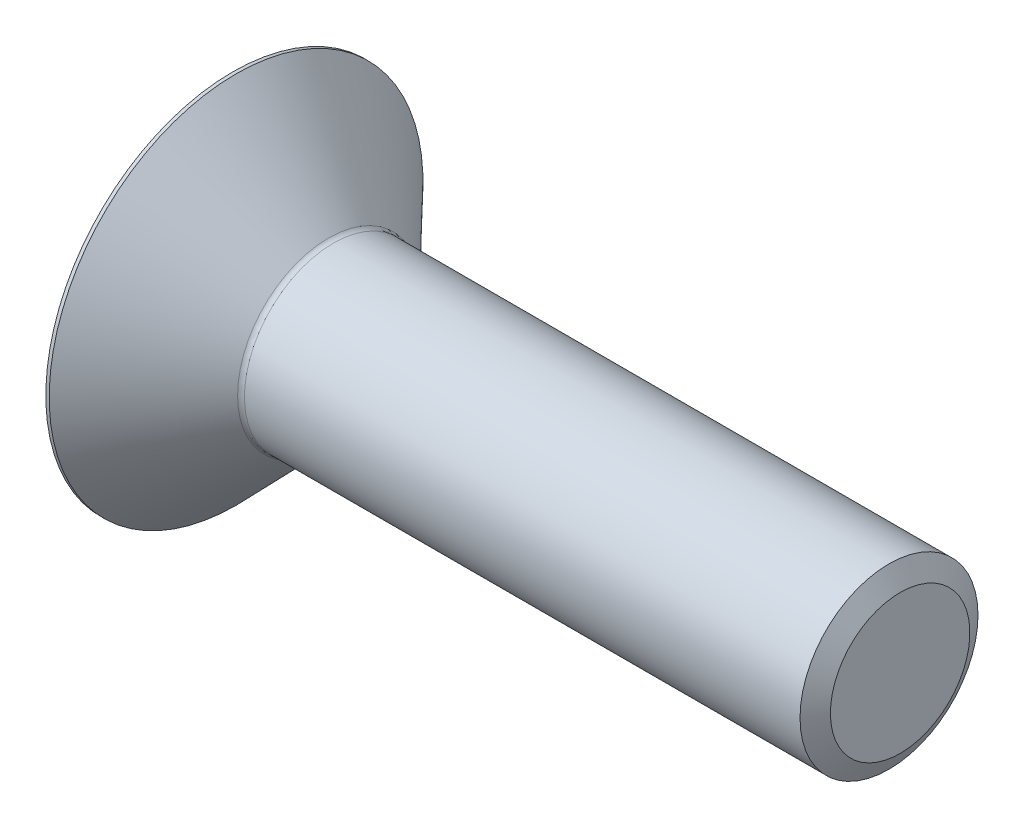
ISO-10303-21;
HEADER;
FILE_DESCRIPTION(('STEP AP214'),'2;1');
FILE_NAME('part.step','',(''),(''),'','','');
FILE_SCHEMA(('AUTOMOTIVE_DESIGN { 1 0 10303 214 1 1 1 1 }'));
ENDSEC;
DATA;
#1=APPLICATION_CONTEXT('core data for automotive mechanical design processes');
#2=APPLICATION_PROTOCOL_DEFINITION('international standard','automotive_design',2000,#1);
#3=PRODUCT_CONTEXT('',#1,'mechanical');
#4=PRODUCT('Part','Part','',(#3));
#5=PRODUCT_RELATED_PRODUCT_CATEGORY('part','',(#4));
#6=PRODUCT_DEFINITION_FORMATION('','',#4);
#7=PRODUCT_DEFINITION_CONTEXT('part definition',#1,'design');
#8=PRODUCT_DEFINITION('design','',#6,#7);
#9=PRODUCT_DEFINITION_SHAPE('','',#8);
#10=(LENGTH_UNIT() NAMED_UNIT(*) SI_UNIT(.MILLI.,.METRE.));
#11=(NAMED_UNIT(*) PLANE_ANGLE_UNIT() SI_UNIT($,.RADIAN.));
#12=(NAMED_UNIT(*) SI_UNIT($,.STERADIAN.) SOLID_ANGLE_UNIT());
#13=UNCERTAINTY_MEASURE_WITH_UNIT(LENGTH_MEASURE(1.E-05),#10,'distance_accuracy_value','');
#14=(GEOMETRIC_REPRESENTATION_CONTEXT(3) GLOBAL_UNCERTAINTY_ASSIGNED_CONTEXT((#13)) GLOBAL_UNIT_ASSIGNED_CONTEXT((#10,
#11,#12)) REPRESENTATION_CONTEXT('',''));
#15=CARTESIAN_POINT('',(0.,0.,0.));
#16=DIRECTION('',(0.,0.,1.));
#17=DIRECTION('',(1.,0.,0.));
#18=AXIS2_PLACEMENT_3D('',#15,#16,#17);
#19=CARTESIAN_POINT('',(0.,0.,0.));
#20=DIRECTION('',(1.,0.,0.));
#21=DIRECTION('',(0.,1.,0.));
#22=AXIS2_PLACEMENT_3D('',#19,#20,#21);
#23=CYLINDRICAL_SURFACE('',#22,8.);
#24=CARTESIAN_POINT('',(-50.9453151102742,0.,0.));
#25=DIRECTION('',(1.,0.,0.));
#26=DIRECTION('',(0.,1.,0.));
#27=AXIS2_PLACEMENT_3D('',#24,#25,#26);
#28=CIRCLE('',#27,8.);
#29=CARTESIAN_POINT('',(-50.9453151102742,7.99999999999999,0.));
#30=VERTEX_POINT('',#29);
#31=EDGE_CURVE('E127',#30,#30,#28,.T.);
#32=ORIENTED_EDGE('',*,*,#31,.T.);
#33=EDGE_LOOP('',(#32));
#34=FACE_BOUND('',#33,.T.);
#35=CARTESIAN_POINT('',(-0.999999999999998,0.,0.));
#36=DIRECTION('',(-1.,0.,0.));
#37=DIRECTION('',(0.,0.,1.));
#38=AXIS2_PLACEMENT_3D('',#35,#36,#37);
#39=CIRCLE('',#38,8.);
#40=CARTESIAN_POINT('',(-0.999999999999998,0.,8.));
#41=VERTEX_POINT('',#40);
#42=EDGE_CURVE('E314',#41,#41,#39,.T.);
#43=ORIENTED_EDGE('',*,*,#42,.T.);
#44=EDGE_LOOP('',(#43));
#45=FACE_BOUND('',#44,.T.);
#46=ADVANCED_FACE('F40',(#34,#45),#23,.T.);
#47=CARTESIAN_POINT('',(-60.,16.8,0.));
#48=DIRECTION('',(-1.,0.,0.));
#49=DIRECTION('',(0.,-1.,0.));
#50=AXIS2_PLACEMENT_3D('',#47,#48,#49);
#51=PLANE('',#50);
#52=CARTESIAN_POINT('',(-60.,0.,0.));
#53=DIRECTION('',(1.,0.,0.));
#54=DIRECTION('',(0.,1.,0.));
#55=AXIS2_PLACEMENT_3D('',#52,#53,#54);
#56=CIRCLE('',#55,16.8);
#57=CARTESIAN_POINT('',(-60.,16.8,0.));
#58=VERTEX_POINT('',#57);
#59=EDGE_CURVE('E216',#58,#58,#56,.T.);
#60=ORIENTED_EDGE('',*,*,#59,.F.);
#61=EDGE_LOOP('',(#60));
#62=FACE_BOUND('',#61,.T.);
#63=CARTESIAN_POINT('',(-60.,0.,0.));
#64=DIRECTION('',(-1.,0.,0.));
#65=DIRECTION('',(0.,-1.,0.));
#66=AXIS2_PLACEMENT_3D('',#63,#64,#65);
#67=CIRCLE('',#66,5.77350269189624);
#68=CARTESIAN_POINT('',(-60.,-2.88675134594816,4.99999999999997));
#69=VERTEX_POINT('',#68);
#70=CARTESIAN_POINT('',(-60.,-5.77350269189625,0.));
#71=VERTEX_POINT('',#70);
#72=EDGE_CURVE('E44',#69,#71,#67,.F.);
#73=ORIENTED_EDGE('',*,*,#72,.T.);
#74=CARTESIAN_POINT('',(-60.,-2.88675134594816,-4.99999999999997));
#75=VERTEX_POINT('',#74);
#76=EDGE_CURVE('E11',#71,#75,#67,.F.);
#77=ORIENTED_EDGE('',*,*,#76,.T.);
#78=CARTESIAN_POINT('',(-60.,2.88675134594812,-5.));
#79=VERTEX_POINT('',#78);
#80=EDGE_CURVE('E49',#75,#79,#67,.F.);
#81=ORIENTED_EDGE('',*,*,#80,.T.);
#82=CARTESIAN_POINT('',(-60.,5.77350269189625,0.));
#83=VERTEX_POINT('',#82);
#84=EDGE_CURVE('E114',#79,#83,#67,.F.);
#85=ORIENTED_EDGE('',*,*,#84,.T.);
#86=CARTESIAN_POINT('',(-60.,0.,0.));
#87=DIRECTION('',(-1.,0.,0.));
#88=DIRECTION('',(0.,0.,1.));
#89=AXIS2_PLACEMENT_3D('',#86,#87,#88);
#90=CIRCLE('',#89,5.77350269189625);
#91=CARTESIAN_POINT('',(-60.,2.88675134594814,4.99999999999998));
#92=VERTEX_POINT('',#91);
#93=EDGE_CURVE('E99',#92,#83,#90,.T.);
#94=ORIENTED_EDGE('',*,*,#93,.F.);
#95=EDGE_CURVE('E108',#92,#69,#67,.F.);
#96=ORIENTED_EDGE('',*,*,#95,.T.);
#97=EDGE_LOOP('',(#73,#77,#81,#85,#94,#96));
#98=FACE_BOUND('',#97,.T.);
#99=ADVANCED_FACE('F115',(#62,#98),#51,.T.);
#100=CARTESIAN_POINT('',(0.,0.,0.));
#101=DIRECTION('',(1.,0.,0.));
#102=DIRECTION('',(0.,1.,0.));
#103=AXIS2_PLACEMENT_3D('',#100,#101,#102);
#104=CYLINDRICAL_SURFACE('',#103,16.8);
#105=ORIENTED_EDGE('',*,*,#59,.T.);
#106=EDGE_LOOP('',(#105));
#107=FACE_BOUND('',#106,.T.);
#108=CARTESIAN_POINT('',(-59.6980612183022,0.,0.));
#109=DIRECTION('',(1.,0.,0.));
#110=DIRECTION('',(0.,1.,0.));
#111=AXIS2_PLACEMENT_3D('',#108,#109,#110);
#112=CIRCLE('',#111,16.8);
#113=CARTESIAN_POINT('',(-59.6980612183022,16.8,0.));
#114=VERTEX_POINT('',#113);
#115=EDGE_CURVE('E218',#114,#114,#112,.T.);
#116=ORIENTED_EDGE('',*,*,#115,.F.);
#117=EDGE_LOOP('',(#116));
#118=FACE_BOUND('',#117,.T.);
#119=ADVANCED_FACE('F206',(#107,#118),#104,.T.);
#120=CARTESIAN_POINT('',(-51.3769189904774,0.,0.));
#121=DIRECTION('',(-1.,0.,0.));
#122=DIRECTION('',(0.,-1.,0.));
#123=AXIS2_PLACEMENT_3D('',#120,#121,#122);
#124=CONICAL_SURFACE('',#123,8.1832049777246,0.802851455917393);
#125=ORIENTED_EDGE('',*,*,#115,.T.);
#126=EDGE_LOOP('',(#125));
#127=FACE_BOUND('',#126,.T.);
#128=CARTESIAN_POINT('',(-51.3769189904774,0.,0.));
#129=DIRECTION('',(1.,0.,0.));
#130=DIRECTION('',(0.,1.,0.));
#131=AXIS2_PLACEMENT_3D('',#128,#129,#130);
#132=CIRCLE('',#131,8.1832049777246);
#133=CARTESIAN_POINT('',(-51.3769189904774,8.18320497772459,0.));
#134=VERTEX_POINT('',#133);
#135=EDGE_CURVE('E222',#134,#134,#132,.T.);
#136=ORIENTED_EDGE('',*,*,#135,.F.);
#137=EDGE_LOOP('',(#136));
#138=FACE_BOUND('',#137,.T.);
#139=ADVANCED_FACE('F202',(#127,#138),#124,.T.);
#140=CARTESIAN_POINT('',(-50.9453151102742,0.,0.));
#141=DIRECTION('',(1.,0.,0.));
#142=DIRECTION('',(0.,1.,0.));
#143=AXIS2_PLACEMENT_3D('',#140,#141,#142);
#144=TOROIDAL_SURFACE('',#143,8.6,0.600000000000004);
#145=ORIENTED_EDGE('',*,*,#135,.T.);
#146=EDGE_LOOP('',(#145));
#147=FACE_BOUND('',#146,.T.);
#148=ORIENTED_EDGE('',*,*,#31,.F.);
#149=EDGE_LOOP('',(#148));
#150=FACE_BOUND('',#149,.T.);
#151=ADVANCED_FACE('F198',(#147,#150),#144,.F.);
#152=CARTESIAN_POINT('',(-58.57,0.,0.));
#153=DIRECTION('',(-1.,0.,0.));
#154=DIRECTION('',(0.,0.,1.));
#155=AXIS2_PLACEMENT_3D('',#152,#153,#154);
#156=CONICAL_SURFACE('',#155,0.,1.3279993054688);
#157=CARTESIAN_POINT('',(-60.000028600858,-2.8866358758943,5.0002));
#158=CARTESIAN_POINT('',(-59.9703064785805,-3.00658291363876,4.79244563640922));
#159=CARTESIAN_POINT('',(-59.9433331628954,-3.126716242524,4.5843686070976));
#160=CARTESIAN_POINT('',(-59.8959548746468,-3.36734556049106,4.167586402588));
#161=CARTESIAN_POINT('',(-59.8755521644538,-3.48784166009781,3.95888103595523));
#162=CARTESIAN_POINT('',(-59.8424809198998,-3.72857139110825,3.54192491095276));
#163=CARTESIAN_POINT('',(-59.8297786344913,-3.84880383232204,3.33367621405244));
#164=CARTESIAN_POINT('',(-59.8127470243086,-4.08939987181745,2.91695164954654));
#165=CARTESIAN_POINT('',(-59.8084163274117,-4.20976344536983,2.70847582477327));
#166=CARTESIAN_POINT('',(-59.8084163274117,-4.45049059247458,2.29152417522673));
#167=CARTESIAN_POINT('',(-59.8127470243086,-4.57085416602696,2.08304835045346));
#168=CARTESIAN_POINT('',(-59.8297786344913,-4.81145020552237,1.66632378594756));
#169=CARTESIAN_POINT('',(-59.8424809198998,-4.93168264673616,1.45807508904724));
#170=CARTESIAN_POINT('',(-59.8755521644538,-5.1724123777466,1.04111896404477));
#171=CARTESIAN_POINT('',(-59.8959548746468,-5.29290847735334,0.832413597412002));
#172=CARTESIAN_POINT('',(-59.9433331628954,-5.53353779532041,0.415631392902402));
#173=CARTESIAN_POINT('',(-59.9703064785805,-5.65367112420565,0.207554363590779));
#174=CARTESIAN_POINT('',(-60.000028600858,-5.7736181619501,-0.000199999999999282));
#175=B_SPLINE_CURVE_WITH_KNOTS('',3,(#157,#158,#159,#160,#161,#162,#163,#164,#165,#166,#167,
#168,#169,#170,#171,#172,#173,#174),.UNSPECIFIED.,.F.,.F.,(4,2,2,2,2,2,2,2,4),(0.,
0.725216988477179,1.45068341512269,2.17294668128456,2.89509155678516,3.61723643228576,
4.33949969844763,5.06496612509314,5.79018311357032),.UNSPECIFIED.);
#176=EDGE_CURVE('E133',#69,#71,#175,.T.);
#177=ORIENTED_EDGE('',*,*,#176,.T.);
#178=ORIENTED_EDGE('',*,*,#72,.F.);
#179=EDGE_LOOP('',(#177,#178));
#180=FACE_BOUND('',#179,.T.);
#181=ADVANCED_FACE('F201',(#180),#156,.F.);
#182=CARTESIAN_POINT('',(-60.8123413427193,-7.54728704086122,5.));
#183=CARTESIAN_POINT('',(-60.7657016101994,-7.32134783765798,5.));
#184=CARTESIAN_POINT('',(-60.7196508998255,-7.09528487292817,5.));
#185=CARTESIAN_POINT('',(-60.6290437275422,-6.64285095945758,5.));
#186=CARTESIAN_POINT('',(-60.5844873234847,-6.41647999914505,5.));
#187=CARTESIAN_POINT('',(-60.4971503538889,-5.96318847065372,5.));
#188=CARTESIAN_POINT('',(-60.454371379604,-5.73626759461239,5.));
#189=CARTESIAN_POINT('',(-60.3710570488763,-5.28201528457377,5.));
#190=CARTESIAN_POINT('',(-60.3305216753063,-5.05468385372423,5.));
#191=CARTESIAN_POINT('',(-60.2525080028904,-4.60119902599499,5.));
#192=CARTESIAN_POINT('',(-60.2150095633967,-4.37504913018959,5.));
#193=CARTESIAN_POINT('',(-60.1433922675738,-3.92221613676521,5.));
#194=CARTESIAN_POINT('',(-60.1092734787763,-3.69553302858426,5.));
#195=CARTESIAN_POINT('',(-60.0131398289173,-3.01464145649151,5.));
#196=CARTESIAN_POINT('',(-59.9573308069902,-2.55949626778529,5.));
#197=CARTESIAN_POINT('',(-59.8914013673432,-1.87286364684652,5.));
#198=CARTESIAN_POINT('',(-59.8723415266682,-1.64223098590901,5.));
#199=CARTESIAN_POINT('',(-59.841273780519,-1.18048410750398,5.));
#200=CARTESIAN_POINT('',(-59.8292657414402,-0.949369899243186,5.));
#201=CARTESIAN_POINT('',(-59.8129851601704,-0.48694889706356,5.));
#202=CARTESIAN_POINT('',(-59.8087098000087,-0.255642204047035,5.));
#203=CARTESIAN_POINT('',(-59.8081521787743,0.206981402664876,5.));
#204=CARTESIAN_POINT('',(-59.8118699238524,0.438298316367989,5.));
#205=CARTESIAN_POINT('',(-59.8270929829213,0.901464372826739,5.));
#206=CARTESIAN_POINT('',(-59.8386249470293,1.13331262208489,5.));
#207=CARTESIAN_POINT('',(-59.868837875344,1.59654493177013,5.));
#208=CARTESIAN_POINT('',(-59.8875191632843,1.82792897069999,5.));
#209=CARTESIAN_POINT('',(-59.9311174998262,2.29022266195028,5.));
#210=CARTESIAN_POINT('',(-59.9560378195098,2.52113200115898,5.));
#211=CARTESIAN_POINT('',(-60.0111119625176,2.9823184300827,5.));
#212=CARTESIAN_POINT('',(-60.0412657903177,3.21259551925684,5.));
#213=CARTESIAN_POINT('',(-60.1063920419946,3.67626324301616,5.));
#214=CARTESIAN_POINT('',(-60.1414345594141,3.90964394433748,5.));
#215=CARTESIAN_POINT('',(-60.2151048790198,4.3758407629026,5.));
#216=CARTESIAN_POINT('',(-60.2537327727284,4.60865686557837,5.));
#217=CARTESIAN_POINT('',(-60.3338743957146,5.07381323311372,5.));
#218=CARTESIAN_POINT('',(-60.3753884128528,5.30615344812245,5.));
#219=CARTESIAN_POINT('',(-60.4607414400444,5.77040752975494,5.));
#220=CARTESIAN_POINT('',(-60.5045804790893,6.002321391025,5.));
#221=CARTESIAN_POINT('',(-60.638917490686,6.69765323819205,5.));
#222=CARTESIAN_POINT('',(-60.7322121655522,7.16053013734902,5.));
#223=CARTESIAN_POINT('',(-60.9237332813334,8.08522124823685,5.));
#224=CARTESIAN_POINT('',(-61.0219594138883,8.54703552452879,5.));
#225=CARTESIAN_POINT('',(-61.220813680747,9.4652608142149,5.));
#226=CARTESIAN_POINT('',(-61.3214075170485,9.92167927501046,5.));
#227=CARTESIAN_POINT('',(-61.5249798952457,10.8339916608724,5.));
#228=CARTESIAN_POINT('',(-61.6279584830498,11.2898855756632,5.));
#229=CARTESIAN_POINT('',(-61.8355292829418,12.2007194358041,5.));
#230=CARTESIAN_POINT('',(-61.9401193705397,12.6556598662232,5.));
#231=CARTESIAN_POINT('',(-62.1506271606403,13.5652187130197,5.));
#232=CARTESIAN_POINT('',(-62.2565448215921,14.0198371390071,5.));
#233=CARTESIAN_POINT('',(-62.3629252533376,14.4743459636508,5.));
#234=B_SPLINE_CURVE_WITH_KNOTS('',3,(#182,#183,#184,#185,#186,#187,#188,#189,#190,#191,#192,
#193,#194,#195,#196,#197,#198,#199,#200,#201,#202,#203,#204,#205,#206,#207,#208,#209,#210,#211,
#212,#213,#214,#215,#216,#217,#218,#219,#220,#221,#222,#223,#224,#225,#226,#227,#228,#229,#230,
#231,#232,#233),.UNSPECIFIED.,.F.,.F.,(4,2,2,2,2,2,2,2,2,2,2,2,2,2,2,2,2,2,2,2,2,2,2,2,2,4),(0.,
0.692110799324258,1.38424836270832,2.07699277152321,2.76973189135693,3.45741847394325,
4.14511879500199,5.52023162677551,6.21440066049326,6.90855654194766,7.60245940561108,
8.2963628032423,8.99264472460236,9.68895817851127,10.3856374721728,11.0823173616475,
11.7902736474789,12.4982480099759,13.2062930871061,13.9143469952163,15.3308549021747,
16.747274346133,18.1493822265223,19.5515171211636,20.9519394602674,22.3523180773603),.UNSPECIFIED.);
#235=EDGE_CURVE('E104',#92,#69,#234,.F.);
#236=ORIENTED_EDGE('',*,*,#235,.T.);
#237=ORIENTED_EDGE('',*,*,#95,.F.);
#238=EDGE_LOOP('',(#236,#237));
#239=FACE_BOUND('',#238,.T.);
#240=ADVANCED_FACE('F109',(#239),#156,.F.);
#241=CARTESIAN_POINT('',(-60.000028600858,5.77361816195008,-0.00020000000000257));
#242=CARTESIAN_POINT('',(-59.9703064785805,5.65367112420563,0.207554363590776));
#243=CARTESIAN_POINT('',(-59.9433331628954,5.53353779532039,0.415631392902399));
#244=CARTESIAN_POINT('',(-59.8959548746468,5.29290847735332,0.832413597411999));
#245=CARTESIAN_POINT('',(-59.8755521644538,5.17241237774658,1.04111896404476));
#246=CARTESIAN_POINT('',(-59.8424809198998,4.93168264673614,1.45807508904723));
#247=CARTESIAN_POINT('',(-59.8297786344913,4.81145020552235,1.66632378594756));
#248=CARTESIAN_POINT('',(-59.8127470243086,4.57085416602694,2.08304835045345));
#249=CARTESIAN_POINT('',(-59.8084163274117,4.45049059247456,2.29152417522673));
#250=CARTESIAN_POINT('',(-59.8084163274117,4.20976344536981,2.70847582477327));
#251=CARTESIAN_POINT('',(-59.8127470243086,4.08939987181743,2.91695164954654));
#252=CARTESIAN_POINT('',(-59.8297786344913,3.84880383232202,3.33367621405244));
#253=CARTESIAN_POINT('',(-59.8424809198998,3.72857139110823,3.54192491095276));
#254=CARTESIAN_POINT('',(-59.8755521644538,3.48784166009779,3.95888103595523));
#255=CARTESIAN_POINT('',(-59.8959548746468,3.36734556049104,4.167586402588));
#256=CARTESIAN_POINT('',(-59.9433331628954,3.12671624252398,4.5843686070976));
#257=CARTESIAN_POINT('',(-59.9703064785805,3.00658291363874,4.79244563640922));
#258=CARTESIAN_POINT('',(-60.000028600858,2.88663587589428,5.0002));
#259=B_SPLINE_CURVE_WITH_KNOTS('',3,(#241,#242,#243,#244,#245,#246,#247,#248,#249,#250,#251,
#252,#253,#254,#255,#256,#257,#258),.UNSPECIFIED.,.F.,.F.,(4,2,2,2,2,2,2,2,4),(0.,
0.725216988477178,1.45068341512269,2.17294668128456,2.89509155678516,3.61723643228576,
4.33949969844763,5.06496612509314,5.79018311357032),.UNSPECIFIED.);
#260=EDGE_CURVE('E95',#83,#92,#259,.T.);
#261=ORIENTED_EDGE('',*,*,#260,.T.);
#262=ORIENTED_EDGE('',*,*,#93,.T.);
#263=EDGE_LOOP('',(#261,#262));
#264=FACE_BOUND('',#263,.T.);
#265=ADVANCED_FACE('F97',(#264),#156,.F.);
#266=CARTESIAN_POINT('',(-60.000028600858,2.88663587589428,-5.0002));
#267=CARTESIAN_POINT('',(-59.9703064785805,3.00658291363873,-4.79244563640922));
#268=CARTESIAN_POINT('',(-59.9433331628954,3.12671624252398,-4.5843686070976));
#269=CARTESIAN_POINT('',(-59.8959548746468,3.36734556049104,-4.167586402588));
#270=CARTESIAN_POINT('',(-59.8755521644538,3.48784166009779,-3.95888103595523));
#271=CARTESIAN_POINT('',(-59.8424809198998,3.72857139110823,-3.54192491095276));
#272=CARTESIAN_POINT('',(-59.8297786344913,3.84880383232202,-3.33367621405244));
#273=CARTESIAN_POINT('',(-59.8127470243086,4.08939987181743,-2.91695164954655));
#274=CARTESIAN_POINT('',(-59.8084163274117,4.20976344536981,-2.70847582477327));
#275=CARTESIAN_POINT('',(-59.8084163274117,4.45049059247456,-2.29152417522673));
#276=CARTESIAN_POINT('',(-59.8127470243086,4.57085416602694,-2.08304835045346));
#277=CARTESIAN_POINT('',(-59.8297786344913,4.81145020552235,-1.66632378594756));
#278=CARTESIAN_POINT('',(-59.8424809198998,4.93168264673614,-1.45807508904724));
#279=CARTESIAN_POINT('',(-59.8755521644538,5.17241237774658,-1.04111896404477));
#280=CARTESIAN_POINT('',(-59.8959548746468,5.29290847735332,-0.832413597412004));
#281=CARTESIAN_POINT('',(-59.9433331628954,5.53353779532039,-0.415631392902404));
#282=CARTESIAN_POINT('',(-59.9703064785805,5.65367112420563,-0.207554363590781));
#283=CARTESIAN_POINT('',(-60.000028600858,5.77361816195009,0.00019999999999689));
#284=B_SPLINE_CURVE_WITH_KNOTS('',3,(#266,#267,#268,#269,#270,#271,#272,#273,#274,#275,#276,
#277,#278,#279,#280,#281,#282,#283),.UNSPECIFIED.,.F.,.F.,(4,2,2,2,2,2,2,2,4),(0.,
0.725216988477179,1.45068341512269,2.17294668128456,2.89509155678516,3.61723643228576,
4.33949969844763,5.06496612509314,5.79018311357032),.UNSPECIFIED.);
#285=EDGE_CURVE('E117',#79,#83,#284,.T.);
#286=ORIENTED_EDGE('',*,*,#285,.T.);
#287=ORIENTED_EDGE('',*,*,#84,.F.);
#288=EDGE_LOOP('',(#286,#287));
#289=FACE_BOUND('',#288,.T.);
#290=ADVANCED_FACE('F297',(#289),#156,.F.);
#291=CARTESIAN_POINT('',(-60.8123413427193,-7.54728704086122,-5.));
#292=CARTESIAN_POINT('',(-60.7657016101994,-7.32134783765798,-5.));
#293=CARTESIAN_POINT('',(-60.7196508998255,-7.09528487292817,-5.));
#294=CARTESIAN_POINT('',(-60.6290437275422,-6.64285095945758,-5.));
#295=CARTESIAN_POINT('',(-60.5844873234847,-6.41647999914505,-5.));
#296=CARTESIAN_POINT('',(-60.4971503538889,-5.96318847065372,-5.));
#297=CARTESIAN_POINT('',(-60.454371379604,-5.7362675946124,-5.));
#298=CARTESIAN_POINT('',(-60.3710570488763,-5.28201528457377,-5.));
#299=CARTESIAN_POINT('',(-60.3305216753063,-5.05468385372423,-5.));
#300=CARTESIAN_POINT('',(-60.2525080028904,-4.60119902599499,-5.));
#301=CARTESIAN_POINT('',(-60.2150095633967,-4.37504913018959,-5.));
#302=CARTESIAN_POINT('',(-60.1433922675738,-3.92221613676521,-5.));
#303=CARTESIAN_POINT('',(-60.1092734787763,-3.69553302858426,-5.));
#304=CARTESIAN_POINT('',(-60.0131398289173,-3.01464145649151,-5.));
#305=CARTESIAN_POINT('',(-59.9573308069902,-2.55949626778529,-5.));
#306=CARTESIAN_POINT('',(-59.8914013673432,-1.87286364684652,-5.));
#307=CARTESIAN_POINT('',(-59.8723415266682,-1.64223098590901,-5.));
#308=CARTESIAN_POINT('',(-59.841273780519,-1.18048410750398,-5.));
#309=CARTESIAN_POINT('',(-59.8292657414402,-0.949369899243186,-5.));
#310=CARTESIAN_POINT('',(-59.8129851601704,-0.48694889706356,-5.));
#311=CARTESIAN_POINT('',(-59.8087098000087,-0.255642204047034,-5.));
#312=CARTESIAN_POINT('',(-59.8081521787743,0.206981402664876,-5.));
#313=CARTESIAN_POINT('',(-59.8118699238524,0.438298316367989,-5.));
#314=CARTESIAN_POINT('',(-59.8270929829213,0.901464372826738,-5.));
#315=CARTESIAN_POINT('',(-59.8386249470293,1.13331262208489,-5.));
#316=CARTESIAN_POINT('',(-59.868837875344,1.59654493177013,-5.));
#317=CARTESIAN_POINT('',(-59.8875191632843,1.82792897069999,-5.));
#318=CARTESIAN_POINT('',(-59.9311174998262,2.29022266195027,-5.));
#319=CARTESIAN_POINT('',(-59.9560378195098,2.52113200115898,-5.));
#320=CARTESIAN_POINT('',(-60.0111119625176,2.9823184300827,-5.));
#321=CARTESIAN_POINT('',(-60.0412657903177,3.21259551925684,-5.));
#322=CARTESIAN_POINT('',(-60.1063920419946,3.67626324301616,-5.));
#323=CARTESIAN_POINT('',(-60.1414345594141,3.90964394433748,-5.));
#324=CARTESIAN_POINT('',(-60.2151048790198,4.3758407629026,-5.));
#325=CARTESIAN_POINT('',(-60.2537327727284,4.60865686557838,-5.));
#326=CARTESIAN_POINT('',(-60.3338743957146,5.07381323311372,-5.));
#327=CARTESIAN_POINT('',(-60.3753884128528,5.30615344812245,-5.));
#328=CARTESIAN_POINT('',(-60.4607414400444,5.77040752975494,-5.));
#329=CARTESIAN_POINT('',(-60.5045804790893,6.002321391025,-5.));
#330=CARTESIAN_POINT('',(-60.638917490686,6.69765323819206,-5.));
#331=CARTESIAN_POINT('',(-60.7322121655522,7.16053013734902,-5.));
#332=CARTESIAN_POINT('',(-60.9237332813334,8.08522124823685,-5.));
#333=CARTESIAN_POINT('',(-61.0219594138883,8.5470355245288,-5.));
#334=CARTESIAN_POINT('',(-61.220813680747,9.46526081421491,-5.));
#335=CARTESIAN_POINT('',(-61.3214075170485,9.92167927501047,-5.));
#336=CARTESIAN_POINT('',(-61.5249798952457,10.8339916608724,-5.));
#337=CARTESIAN_POINT('',(-61.6279584830498,11.2898855756632,-5.));
#338=CARTESIAN_POINT('',(-61.8355292829418,12.2007194358041,-5.));
#339=CARTESIAN_POINT('',(-61.9401193705397,12.6556598662232,-5.));
#340=CARTESIAN_POINT('',(-62.1506271606403,13.5652187130197,-5.));
#341=CARTESIAN_POINT('',(-62.2565448215921,14.0198371390071,-5.));
#342=CARTESIAN_POINT('',(-62.3629252533376,14.4743459636508,-5.));
#343=B_SPLINE_CURVE_WITH_KNOTS('',3,(#291,#292,#293,#294,#295,#296,#297,#298,#299,#300,#301,
#302,#303,#304,#305,#306,#307,#308,#309,#310,#311,#312,#313,#314,#315,#316,#317,#318,#319,#320,
#321,#322,#323,#324,#325,#326,#327,#328,#329,#330,#331,#332,#333,#334,#335,#336,#337,#338,#339,
#340,#341,#342),.UNSPECIFIED.,.F.,.F.,(4,2,2,2,2,2,2,2,2,2,2,2,2,2,2,2,2,2,2,2,2,2,2,2,2,4),(0.,
0.692110799324258,1.38424836270832,2.07699277152321,2.76973189135693,3.45741847394325,
4.14511879500199,5.52023162677551,6.21440066049326,6.90855654194766,7.60245940561108,
8.2963628032423,8.99264472460236,9.68895817851127,10.3856374721728,11.0823173616475,
11.7902736474789,12.4982480099759,13.2062930871061,13.9143469952163,15.3308549021747,
16.747274346133,18.1493822265223,19.5515171211636,20.9519394602674,22.3523180773603),.UNSPECIFIED.);
#344=EDGE_CURVE('E252',#75,#79,#343,.T.);
#345=ORIENTED_EDGE('',*,*,#344,.T.);
#346=ORIENTED_EDGE('',*,*,#80,.F.);
#347=EDGE_LOOP('',(#345,#346));
#348=FACE_BOUND('',#347,.T.);
#349=ADVANCED_FACE('F284',(#348),#156,.F.);
#350=CARTESIAN_POINT('',(-60.000028600858,-5.7736181619501,0.000200000000001786));
#351=CARTESIAN_POINT('',(-59.9703064785805,-5.65367112420565,-0.207554363590777));
#352=CARTESIAN_POINT('',(-59.9433331628954,-5.53353779532041,-0.4156313929024));
#353=CARTESIAN_POINT('',(-59.8959548746468,-5.29290847735334,-0.832413597412));
#354=CARTESIAN_POINT('',(-59.8755521644538,-5.1724123777466,-1.04111896404476));
#355=CARTESIAN_POINT('',(-59.8424809198998,-4.93168264673616,-1.45807508904724));
#356=CARTESIAN_POINT('',(-59.8297786344913,-4.81145020552237,-1.66632378594756));
#357=CARTESIAN_POINT('',(-59.8127470243086,-4.57085416602696,-2.08304835045345));
#358=CARTESIAN_POINT('',(-59.8084163274117,-4.45049059247458,-2.29152417522673));
#359=CARTESIAN_POINT('',(-59.8084163274117,-4.20976344536982,-2.70847582477327));
#360=CARTESIAN_POINT('',(-59.8127470243086,-4.08939987181745,-2.91695164954654));
#361=CARTESIAN_POINT('',(-59.8297786344913,-3.84880383232204,-3.33367621405244));
#362=CARTESIAN_POINT('',(-59.8424809198998,-3.72857139110825,-3.54192491095276));
#363=CARTESIAN_POINT('',(-59.8755521644538,-3.48784166009781,-3.95888103595523));
#364=CARTESIAN_POINT('',(-59.8959548746468,-3.36734556049106,-4.167586402588));
#365=CARTESIAN_POINT('',(-59.9433331628954,-3.126716242524,-4.5843686070976));
#366=CARTESIAN_POINT('',(-59.9703064785805,-3.00658291363876,-4.79244563640922));
#367=CARTESIAN_POINT('',(-60.000028600858,-2.8866358758943,-5.0002));
#368=B_SPLINE_CURVE_WITH_KNOTS('',3,(#350,#351,#352,#353,#354,#355,#356,#357,#358,#359,#360,
#361,#362,#363,#364,#365,#366,#367),.UNSPECIFIED.,.F.,.F.,(4,2,2,2,2,2,2,2,4),(0.,
0.725216988477179,1.45068341512269,2.17294668128456,2.89509155678516,3.61723643228576,
4.33949969844763,5.06496612509314,5.79018311357032),.UNSPECIFIED.);
#369=EDGE_CURVE('E135',#71,#75,#368,.T.);
#370=ORIENTED_EDGE('',*,*,#369,.T.);
#371=ORIENTED_EDGE('',*,*,#76,.F.);
#372=EDGE_LOOP('',(#370,#371));
#373=FACE_BOUND('',#372,.T.);
#374=ADVANCED_FACE('F287',(#373),#156,.F.);
#375=CARTESIAN_POINT('',(-55.2,0.,0.));
#376=DIRECTION('',(-1.,0.,0.));
#377=DIRECTION('',(0.,0.,1.));
#378=AXIS2_PLACEMENT_3D('',#375,#376,#377);
#379=CONICAL_SURFACE('',#378,5.77350269189625,1.0471975511966);
#380=CARTESIAN_POINT('',(-51.8666666666667,0.,0.));
#381=VERTEX_POINT('',#380);
#382=VERTEX_LOOP('',#381);
#383=FACE_BOUND('',#382,.T.);
#384=CARTESIAN_POINT('',(-57.0591764436973,-7.47572560716869,5.));
#385=CARTESIAN_POINT('',(-56.955587530707,-7.2598083846577,5.));
#386=CARTESIAN_POINT('',(-56.8530745749863,-7.0433651582949,5.));
#387=CARTESIAN_POINT('',(-56.650810954,-6.60914635900336,5.));
#388=CARTESIAN_POINT('',(-56.5510607857571,-6.39137055483876,5.));
#389=CARTESIAN_POINT('',(-56.3543758521531,-5.95295758319413,5.));
#390=CARTESIAN_POINT('',(-56.2574618356153,-5.73231107203225,5.));
#391=CARTESIAN_POINT('',(-56.0679796664316,-5.2891665216958,5.));
#392=CARTESIAN_POINT('',(-55.9754112879594,-5.06666857944204,5.));
#393=CARTESIAN_POINT('',(-55.7934204201943,-4.6136062482453,5.));
#394=CARTESIAN_POINT('',(-55.7041434619106,-4.38298305547744,5.));
#395=CARTESIAN_POINT('',(-55.533012114728,-3.91894712856292,5.));
#396=CARTESIAN_POINT('',(-55.4511585860828,-3.68553407465525,5.));
#397=CARTESIAN_POINT('',(-55.2972114377687,-3.21607584849339,5.));
#398=CARTESIAN_POINT('',(-55.2250956594832,-2.98003802173272,5.));
#399=CARTESIAN_POINT('',(-55.0931005723422,-2.50460036226957,5.));
#400=CARTESIAN_POINT('',(-55.0332171508481,-2.26520168854296,5.));
#401=CARTESIAN_POINT('',(-54.9288685056802,-1.78351008258101,5.));
#402=CARTESIAN_POINT('',(-54.8843722818695,-1.54122399897521,5.));
#403=CARTESIAN_POINT('',(-54.8137153693353,-1.0539411699022,5.));
#404=CARTESIAN_POINT('',(-54.7875534415476,-0.808944608750803,5.));
#405=CARTESIAN_POINT('',(-54.7559924358911,-0.320532796270342,5.));
#406=CARTESIAN_POINT('',(-54.7503483423803,-0.0771337695576221,5.));
#407=CARTESIAN_POINT('',(-54.7596715746346,0.409283822411201,5.));
#408=CARTESIAN_POINT('',(-54.7746401766574,0.652302363176374,5.));
#409=CARTESIAN_POINT('',(-54.8173986868384,1.07311516766724,5.));
#410=CARTESIAN_POINT('',(-54.8408213218327,1.25137460897576,5.));
#411=CARTESIAN_POINT('',(-54.8971457302846,1.6064004492806,5.));
#412=CARTESIAN_POINT('',(-54.9300490260113,1.78316660381088,5.));
#413=CARTESIAN_POINT('',(-55.041229502474,2.31108826392507,5.));
#414=CARTESIAN_POINT('',(-55.1319515983969,2.65964204506468,5.));
#415=CARTESIAN_POINT('',(-55.2869317765356,3.18079254882889,5.));
#416=CARTESIAN_POINT('',(-55.3424565355097,3.35613694408294,5.));
#417=CARTESIAN_POINT('',(-55.4586760052949,3.70512051560527,5.));
#418=CARTESIAN_POINT('',(-55.5193707532184,3.87875967962276,5.));
#419=CARTESIAN_POINT('',(-55.645006298984,4.22440219243739,5.));
#420=CARTESIAN_POINT('',(-55.7099453804422,4.39640617065425,5.));
#421=CARTESIAN_POINT('',(-55.8433656306075,4.73902773485892,5.));
#422=CARTESIAN_POINT('',(-55.9118467408919,4.90964534366005,5.));
#423=CARTESIAN_POINT('',(-56.0910421106876,5.34516780529366,5.));
#424=CARTESIAN_POINT('',(-56.2038718749546,5.60920110756516,5.));
#425=CARTESIAN_POINT('',(-56.4349589401735,6.13488915898357,5.));
#426=CARTESIAN_POINT('',(-56.5532166463399,6.39654372879722,5.));
#427=CARTESIAN_POINT('',(-56.7939365693163,6.91798210525474,5.));
#428=CARTESIAN_POINT('',(-56.9163997846076,7.17776544966785,5.));
#429=CARTESIAN_POINT('',(-57.1645914347307,7.69577048423344,5.));
#430=CARTESIAN_POINT('',(-57.2903199421861,7.95399213949452,5.));
#431=CARTESIAN_POINT('',(-57.5445123239886,8.46946169004444,5.));
#432=CARTESIAN_POINT('',(-57.6729792469304,8.72670807939255,5.));
#433=CARTESIAN_POINT('',(-57.9320002627641,9.24014887471674,5.));
#434=CARTESIAN_POINT('',(-58.0625543728227,9.4963432720186,5.));
#435=CARTESIAN_POINT('',(-58.4567010576709,10.2635488611785,5.));
#436=CARTESIAN_POINT('',(-58.7228179442714,10.7732628121184,5.));
#437=CARTESIAN_POINT('',(-59.2343058728794,11.7422670742662,5.));
#438=CARTESIAN_POINT('',(-59.4792644415013,12.2017760367973,5.));
#439=CARTESIAN_POINT('',(-59.9719758083549,13.1193178082925,5.));
#440=CARTESIAN_POINT('',(-60.219728725089,13.5773505535863,5.));
#441=CARTESIAN_POINT('',(-60.7166924189088,14.4911137882748,5.));
#442=CARTESIAN_POINT('',(-60.9658978850259,14.9468471702631,5.));
#443=CARTESIAN_POINT('',(-61.4659294421049,15.8573900865116,5.));
#444=CARTESIAN_POINT('',(-61.7167554386696,16.3121996725909,5.));
#445=CARTESIAN_POINT('',(-61.9681764067338,16.7666781768487,5.));
#446=B_SPLINE_CURVE_WITH_KNOTS('',3,(#384,#385,#386,#387,#388,#389,#390,#391,#392,#393,#394,
#395,#396,#397,#398,#399,#400,#401,#402,#403,#404,#405,#406,#407,#408,#409,#410,#411,#412,#413,
#414,#415,#416,#417,#418,#419,#420,#421,#422,#423,#424,#425,#426,#427,#428,#429,#430,#431,#432,
#433,#434,#435,#436,#437,#438,#439,#440,#441,#442,#443,#444,#445),.UNSPECIFIED.,.F.,.F.,(4,2,2,
2,2,2,2,2,2,2,2,2,2,2,2,2,2,2,2,2,2,2,2,2,2,2,2,2,2,2,4),(0.,0.718451712321294,1.43703184479598,
2.1599709105432,2.88287236620864,3.6246745874087,4.36656266177555,5.10673302018313,
5.84665411496284,6.58507570687381,7.3234473901314,8.05297222662544,8.78254223448519,
9.32165076767616,9.86084591150228,10.9399123430515,11.4916504904319,12.0433925987369,
12.5949129499388,13.1464242071738,14.007728763203,14.8690977235114,15.7306726254021,
16.5922667060954,17.4548760285542,18.3174924494437,20.0424560734592,21.6046171877485,
23.1668448009434,24.7250988364071,26.2832629063407),.UNSPECIFIED.);
#447=CARTESIAN_POINT('',(-55.2,-2.88675134594814,5.));
#448=VERTEX_POINT('',#447);
#449=CARTESIAN_POINT('',(-55.2,2.88675134594812,5.));
#450=VERTEX_POINT('',#449);
#451=EDGE_CURVE('E167',#448,#450,#446,.T.);
#452=ORIENTED_EDGE('',*,*,#451,.T.);
#453=CARTESIAN_POINT('',(-55.2000666686666,2.88663587589428,5.0002));
#454=CARTESIAN_POINT('',(-55.1268045802524,3.01349970319367,4.78046540547481));
#455=CARTESIAN_POINT('',(-55.0601693345329,3.14144859993848,4.55885141554042));
#456=CARTESIAN_POINT('',(-54.9438570036256,3.3995619353212,4.11178600454649));
#457=CARTESIAN_POINT('',(-54.8942210625306,3.52973095989717,3.88632664040923));
#458=CARTESIAN_POINT('',(-54.8169690380335,3.78847564779797,3.43816769477649));
#459=CARTESIAN_POINT('',(-54.7888383908983,3.91701101576051,3.21553790689581));
#460=CARTESIAN_POINT('',(-54.7636129345685,4.11026620624321,2.88081009815336));
#461=CARTESIAN_POINT('',(-54.7580314723843,4.1747286887931,2.76915780319494));
#462=CARTESIAN_POINT('',(-54.7526202293663,4.30371322717527,2.5457500293262));
#463=CARTESIAN_POINT('',(-54.752790270873,4.36823528110588,2.43399455370969));
#464=CARTESIAN_POINT('',(-54.7611716444068,4.54500768479193,2.12781576914936));
#465=CARTESIAN_POINT('',(-54.775247784512,4.65719946015292,1.93349391403279));
#466=CARTESIAN_POINT('',(-54.8198832697242,4.8808384055798,1.54613989800229));
#467=CARTESIAN_POINT('',(-54.8504578727623,4.99228478956019,1.35310909862843));
#468=CARTESIAN_POINT('',(-54.926886506236,5.21637431361294,0.964974657525143));
#469=CARTESIAN_POINT('',(-54.9730643914935,5.32898917185758,0.769920001358261));
#470=CARTESIAN_POINT('',(-55.0778698071067,5.55253939626497,0.382719654641229));
#471=CARTESIAN_POINT('',(-55.1364727160522,5.66347762579591,0.19056900459191));
#472=CARTESIAN_POINT('',(-55.2000666686666,5.77361816195009,-0.000200000000002368));
#473=B_SPLINE_CURVE_WITH_KNOTS('',3,(#453,#454,#455,#456,#457,#458,#459,#460,#461,#462,#463,
#464,#465,#466,#467,#468,#469,#470,#471,#472),.UNSPECIFIED.,.F.,.F.,(4,2,2,2,2,2,2,2,2,4),(0.,
0.79255584136309,1.58701660053333,2.3618153748728,2.74884076077325,3.13585419177295,
3.80962362599679,4.48401723901189,5.17336882348929,5.86136694793725),.UNSPECIFIED.);
#474=CARTESIAN_POINT('',(-55.2,5.77350269189625,0.));
#475=VERTEX_POINT('',#474);
#476=EDGE_CURVE('E124',#450,#475,#473,.T.);
#477=ORIENTED_EDGE('',*,*,#476,.T.);
#478=CARTESIAN_POINT('',(-55.2000666686666,5.77361816195009,0.00019999999999743));
#479=CARTESIAN_POINT('',(-55.1268045802524,5.6467543346507,-0.219534594525188));
#480=CARTESIAN_POINT('',(-55.0601693345329,5.51880543790589,-0.441148584459582));
#481=CARTESIAN_POINT('',(-54.9438570036256,5.26069210252317,-0.888213995453514));
#482=CARTESIAN_POINT('',(-54.8942210625306,5.1305230779472,-1.11367335959077));
#483=CARTESIAN_POINT('',(-54.8169690380335,4.8717783900464,-1.56183230522351));
#484=CARTESIAN_POINT('',(-54.7888383908983,4.74324302208386,-1.78446209310419));
#485=CARTESIAN_POINT('',(-54.7636129345685,4.54998783160115,-2.11918990184664));
#486=CARTESIAN_POINT('',(-54.7580314723843,4.48552534905127,-2.23084219680506));
#487=CARTESIAN_POINT('',(-54.7526202293663,4.3565408106691,-2.4542499706738));
#488=CARTESIAN_POINT('',(-54.752790270873,4.29201875673849,-2.56600544629031));
#489=CARTESIAN_POINT('',(-54.7611716444068,4.11524635305244,-2.87218423085064));
#490=CARTESIAN_POINT('',(-54.7752477845121,4.00305457769145,-3.06650608596721));
#491=CARTESIAN_POINT('',(-54.8198832697242,3.77941563226457,-3.4538601019977));
#492=CARTESIAN_POINT('',(-54.8504578727623,3.66796924828418,-3.64689090137157));
#493=CARTESIAN_POINT('',(-54.926886506236,3.44387972423143,-4.03502534247485));
#494=CARTESIAN_POINT('',(-54.9730643914935,3.33126486598679,-4.23007999864173));
#495=CARTESIAN_POINT('',(-55.0778698071067,3.10771464157939,-4.61728034535877));
#496=CARTESIAN_POINT('',(-55.1364727160522,2.99677641204846,-4.80943099540809));
#497=CARTESIAN_POINT('',(-55.2000666686666,2.88663587589428,-5.0002));
#498=B_SPLINE_CURVE_WITH_KNOTS('',3,(#478,#479,#480,#481,#482,#483,#484,#485,#486,#487,#488,
#489,#490,#491,#492,#493,#494,#495,#496,#497),.UNSPECIFIED.,.F.,.F.,(4,2,2,2,2,2,2,2,2,4),(0.,
0.792555841363088,1.58701660053333,2.3618153748728,2.74884076077325,3.13585419177294,
3.80962362599679,4.48401723901189,5.17336882348928,5.86136694793725),.UNSPECIFIED.);
#499=CARTESIAN_POINT('',(-55.2,2.88675134594812,-4.99999999999999));
#500=VERTEX_POINT('',#499);
#501=EDGE_CURVE('E217',#475,#500,#498,.T.);
#502=ORIENTED_EDGE('',*,*,#501,.T.);
#503=CARTESIAN_POINT('',(-57.0591764436973,-7.47572560716869,-5.));
#504=CARTESIAN_POINT('',(-56.955587530707,-7.2598083846577,-5.));
#505=CARTESIAN_POINT('',(-56.8530745749864,-7.0433651582949,-5.));
#506=CARTESIAN_POINT('',(-56.650810954,-6.60914635900336,-5.));
#507=CARTESIAN_POINT('',(-56.5510607857571,-6.39137055483876,-5.));
#508=CARTESIAN_POINT('',(-56.3543758521531,-5.95295758319413,-5.));
#509=CARTESIAN_POINT('',(-56.2574618356153,-5.73231107203226,-5.));
#510=CARTESIAN_POINT('',(-56.0679796664316,-5.28916652169581,-5.));
#511=CARTESIAN_POINT('',(-55.9754112879594,-5.06666857944205,-5.));
#512=CARTESIAN_POINT('',(-55.7934204201943,-4.6136062482453,-5.));
#513=CARTESIAN_POINT('',(-55.7041434619106,-4.38298305547744,-5.));
#514=CARTESIAN_POINT('',(-55.533012114728,-3.91894712856292,-5.));
#515=CARTESIAN_POINT('',(-55.4511585860828,-3.68553407465525,-5.));
#516=CARTESIAN_POINT('',(-55.2972114377687,-3.21607584849339,-5.));
#517=CARTESIAN_POINT('',(-55.2250956594832,-2.98003802173272,-5.));
#518=CARTESIAN_POINT('',(-55.0931005723422,-2.50460036226957,-5.));
#519=CARTESIAN_POINT('',(-55.0332171508481,-2.26520168854297,-5.));
#520=CARTESIAN_POINT('',(-54.9288685056802,-1.78351008258101,-5.));
#521=CARTESIAN_POINT('',(-54.8843722818695,-1.54122399897521,-5.));
#522=CARTESIAN_POINT('',(-54.8137153693353,-1.0539411699022,-5.));
#523=CARTESIAN_POINT('',(-54.7875534415476,-0.808944608750804,-5.));
#524=CARTESIAN_POINT('',(-54.7559924358911,-0.320532796270344,-5.));
#525=CARTESIAN_POINT('',(-54.7503483423803,-0.0771337695576237,-5.));
#526=CARTESIAN_POINT('',(-54.7596715746346,0.409283822411199,-5.));
#527=CARTESIAN_POINT('',(-54.7746401766574,0.652302363176373,-5.));
#528=CARTESIAN_POINT('',(-54.8173986868384,1.07311516766724,-5.));
#529=CARTESIAN_POINT('',(-54.8408213218327,1.25137460897576,-5.));
#530=CARTESIAN_POINT('',(-54.8971457302846,1.6064004492806,-5.));
#531=CARTESIAN_POINT('',(-54.9300490260113,1.78316660381088,-5.));
#532=CARTESIAN_POINT('',(-55.041229502474,2.31108826392508,-5.));
#533=CARTESIAN_POINT('',(-55.1319515983969,2.65964204506468,-5.));
#534=CARTESIAN_POINT('',(-55.2869317765356,3.18079254882889,-5.));
#535=CARTESIAN_POINT('',(-55.3424565355097,3.35613694408294,-5.));
#536=CARTESIAN_POINT('',(-55.4586760052949,3.70512051560528,-5.));
#537=CARTESIAN_POINT('',(-55.5193707532184,3.87875967962276,-5.));
#538=CARTESIAN_POINT('',(-55.645006298984,4.22440219243739,-5.));
#539=CARTESIAN_POINT('',(-55.7099453804422,4.39640617065425,-5.));
#540=CARTESIAN_POINT('',(-55.8433656306075,4.73902773485892,-5.));
#541=CARTESIAN_POINT('',(-55.9118467408919,4.90964534366004,-5.));
#542=CARTESIAN_POINT('',(-56.0910421106876,5.34516780529366,-5.));
#543=CARTESIAN_POINT('',(-56.2038718749546,5.60920110756517,-5.));
#544=CARTESIAN_POINT('',(-56.4349589401735,6.13488915898357,-5.));
#545=CARTESIAN_POINT('',(-56.5532166463399,6.39654372879722,-5.));
#546=CARTESIAN_POINT('',(-56.7939365693163,6.91798210525474,-5.));
#547=CARTESIAN_POINT('',(-56.9163997846076,7.17776544966785,-5.));
#548=CARTESIAN_POINT('',(-57.1645914347307,7.69577048423345,-5.));
#549=CARTESIAN_POINT('',(-57.2903199421861,7.95399213949453,-5.));
#550=CARTESIAN_POINT('',(-57.5445123239886,8.46946169004444,-5.));
#551=CARTESIAN_POINT('',(-57.6729792469304,8.72670807939255,-5.));
#552=CARTESIAN_POINT('',(-57.9320002627641,9.24014887471674,-5.));
#553=CARTESIAN_POINT('',(-58.0625543728227,9.4963432720186,-5.));
#554=CARTESIAN_POINT('',(-58.456701057671,10.2635488611785,-5.));
#555=CARTESIAN_POINT('',(-58.7228179442714,10.7732628121184,-5.));
#556=CARTESIAN_POINT('',(-59.2343058728794,11.7422670742662,-5.));
#557=CARTESIAN_POINT('',(-59.4792644415013,12.2017760367973,-5.));
#558=CARTESIAN_POINT('',(-59.9719758083549,13.1193178082925,-5.));
#559=CARTESIAN_POINT('',(-60.219728725089,13.5773505535863,-5.));
#560=CARTESIAN_POINT('',(-60.7166924189088,14.4911137882748,-5.));
#561=CARTESIAN_POINT('',(-60.9658978850259,14.9468471702631,-5.));
#562=CARTESIAN_POINT('',(-61.4659294421049,15.8573900865116,-5.));
#563=CARTESIAN_POINT('',(-61.7167554386696,16.3121996725909,-5.));
#564=CARTESIAN_POINT('',(-61.9681764067338,16.7666781768486,-5.));
#565=B_SPLINE_CURVE_WITH_KNOTS('',3,(#503,#504,#505,#506,#507,#508,#509,#510,#511,#512,#513,
#514,#515,#516,#517,#518,#519,#520,#521,#522,#523,#524,#525,#526,#527,#528,#529,#530,#531,#532,
#533,#534,#535,#536,#537,#538,#539,#540,#541,#542,#543,#544,#545,#546,#547,#548,#549,#550,#551,
#552,#553,#554,#555,#556,#557,#558,#559,#560,#561,#562,#563,#564),.UNSPECIFIED.,.F.,.F.,(4,2,2,
2,2,2,2,2,2,2,2,2,2,2,2,2,2,2,2,2,2,2,2,2,2,2,2,2,2,2,4),(0.,0.718451712321293,1.43703184479597,
2.15997091054319,2.88287236620864,3.6246745874087,4.36656266177555,5.10673302018313,
5.84665411496284,6.58507570687381,7.3234473901314,8.05297222662544,8.78254223448519,
9.32165076767616,9.86084591150228,10.9399123430515,11.4916504904319,12.0433925987369,
12.5949129499388,13.1464242071738,14.007728763203,14.8690977235114,15.7306726254021,
16.5922667060954,17.4548760285542,18.3174924494437,20.0424560734592,21.6046171877485,
23.1668448009434,24.725098836407,26.2832629063406),.UNSPECIFIED.);
#566=CARTESIAN_POINT('',(-55.2,-2.88675134594814,-5.));
#567=VERTEX_POINT('',#566);
#568=EDGE_CURVE('E103',#500,#567,#565,.F.);
#569=ORIENTED_EDGE('',*,*,#568,.T.);
#570=CARTESIAN_POINT('',(-55.2000666686666,-2.8866358758943,-5.0002));
#571=CARTESIAN_POINT('',(-55.1268045802524,-3.01349970319369,-4.78046540547481));
#572=CARTESIAN_POINT('',(-55.0601693345329,-3.1414485999385,-4.55885141554042));
#573=CARTESIAN_POINT('',(-54.9438570036256,-3.39956193532122,-4.11178600454648));
#574=CARTESIAN_POINT('',(-54.8942210625306,-3.52973095989719,-3.88632664040922));
#575=CARTESIAN_POINT('',(-54.8169690380335,-3.78847564779799,-3.43816769477649));
#576=CARTESIAN_POINT('',(-54.7888383908983,-3.91701101576053,-3.2155379068958));
#577=CARTESIAN_POINT('',(-54.7636129345685,-4.11026620624324,-2.88081009815335));
#578=CARTESIAN_POINT('',(-54.7580314723843,-4.17472868879312,-2.76915780319493));
#579=CARTESIAN_POINT('',(-54.7526202293663,-4.30371322717529,-2.5457500293262));
#580=CARTESIAN_POINT('',(-54.752790270873,-4.3682352811059,-2.43399455370968));
#581=CARTESIAN_POINT('',(-54.7611716444068,-4.54500768479195,-2.12781576914936));
#582=CARTESIAN_POINT('',(-54.7752477845121,-4.65719946015293,-1.93349391403278));
#583=CARTESIAN_POINT('',(-54.8198832697242,-4.88083840557982,-1.54613989800229));
#584=CARTESIAN_POINT('',(-54.8504578727623,-4.99228478956021,-1.35310909862843));
#585=CARTESIAN_POINT('',(-54.926886506236,-5.21637431361296,-0.964974657525143));
#586=CARTESIAN_POINT('',(-54.9730643914935,-5.32898917185759,-0.769920001358262));
#587=CARTESIAN_POINT('',(-55.0778698071067,-5.55253939626499,-0.38271965464123));
#588=CARTESIAN_POINT('',(-55.1364727160522,-5.66347762579592,-0.190569004591912));
#589=CARTESIAN_POINT('',(-55.2000666686666,-5.7736181619501,0.00020000000000097));
#590=B_SPLINE_CURVE_WITH_KNOTS('',3,(#570,#571,#572,#573,#574,#575,#576,#577,#578,#579,#580,
#581,#582,#583,#584,#585,#586,#587,#588,#589),.UNSPECIFIED.,.F.,.F.,(4,2,2,2,2,2,2,2,2,4),(0.,
0.792555841363092,1.58701660053334,2.36181537487281,2.74884076077326,3.13585419177295,
3.80962362599679,4.48401723901189,5.17336882348929,5.86136694793725),.UNSPECIFIED.);
#591=CARTESIAN_POINT('',(-55.2,-5.77350269189627,0.));
#592=VERTEX_POINT('',#591);
#593=EDGE_CURVE('E269',#567,#592,#590,.T.);
#594=ORIENTED_EDGE('',*,*,#593,.T.);
#595=CARTESIAN_POINT('',(-55.2000666686666,-5.7736181619501,-0.000199999999997636));
#596=CARTESIAN_POINT('',(-55.1268045802524,-5.64675433465071,0.219534594525188));
#597=CARTESIAN_POINT('',(-55.0601693345329,-5.5188054379059,0.441148584459584));
#598=CARTESIAN_POINT('',(-54.9438570036256,-5.26069210252318,0.888213995453518));
#599=CARTESIAN_POINT('',(-54.8942210625306,-5.13052307794722,1.11367335959078));
#600=CARTESIAN_POINT('',(-54.8169690380335,-4.87177839004642,1.56183230522351));
#601=CARTESIAN_POINT('',(-54.7888383908983,-4.74324302208387,1.7844620931042));
#602=CARTESIAN_POINT('',(-54.7636129345685,-4.54998783160117,2.11918990184665));
#603=CARTESIAN_POINT('',(-54.7580314723843,-4.48552534905128,2.23084219680507));
#604=CARTESIAN_POINT('',(-54.7526202293663,-4.35654081066911,2.4542499706738));
#605=CARTESIAN_POINT('',(-54.752790270873,-4.2920187567385,2.56600544629032));
#606=CARTESIAN_POINT('',(-54.7611716444068,-4.11524635305245,2.87218423085065));
#607=CARTESIAN_POINT('',(-54.7752477845121,-4.00305457769147,3.06650608596722));
#608=CARTESIAN_POINT('',(-54.8198832697242,-3.77941563226458,3.45386010199771));
#609=CARTESIAN_POINT('',(-54.8504578727623,-3.66796924828419,3.64689090137157));
#610=CARTESIAN_POINT('',(-54.926886506236,-3.44387972423145,4.03502534247486));
#611=CARTESIAN_POINT('',(-54.9730643914935,-3.33126486598681,4.23007999864174));
#612=CARTESIAN_POINT('',(-55.0778698071067,-3.10771464157941,4.61728034535877));
#613=CARTESIAN_POINT('',(-55.1364727160522,-2.99677641204848,4.80943099540809));
#614=CARTESIAN_POINT('',(-55.2000666686666,-2.8866358758943,5.0002));
#615=B_SPLINE_CURVE_WITH_KNOTS('',3,(#595,#596,#597,#598,#599,#600,#601,#602,#603,#604,#605,
#606,#607,#608,#609,#610,#611,#612,#613,#614),.UNSPECIFIED.,.F.,.F.,(4,2,2,2,2,2,2,2,2,4),(0.,
0.792555841363092,1.58701660053334,2.36181537487281,2.74884076077326,3.13585419177295,
3.8096236259968,4.48401723901189,5.17336882348928,5.86136694793725),.UNSPECIFIED.);
#616=EDGE_CURVE('E174',#592,#448,#615,.T.);
#617=ORIENTED_EDGE('',*,*,#616,.T.);
#618=EDGE_LOOP('',(#452,#477,#502,#569,#594,#617));
#619=FACE_BOUND('',#618,.T.);
#620=ADVANCED_FACE('F161',(#383,#619),#379,.F.);
#621=CARTESIAN_POINT('',(-51.2,5.77350269189625,0.));
#622=DIRECTION('',(0.,0.866025403784438,-0.5));
#623=DIRECTION('',(0.,0.5,0.866025403784438));
#624=AXIS2_PLACEMENT_3D('',#621,#622,#623);
#625=PLANE('',#624);
#626=ORIENTED_EDGE('',*,*,#285,.F.);
#627=DIRECTION('',(-1.,0.,0.));
#628=VECTOR('',#627,1.);
#629=CARTESIAN_POINT('',(-51.2,2.88675134594812,-5.));
#630=LINE('',#629,#628);
#631=EDGE_CURVE('E235',#500,#79,#630,.T.);
#632=ORIENTED_EDGE('',*,*,#631,.F.);
#633=ORIENTED_EDGE('',*,*,#501,.F.);
#634=DIRECTION('',(-1.,0.,0.));
#635=VECTOR('',#634,1.);
#636=CARTESIAN_POINT('',(-51.2,5.77350269189625,0.));
#637=LINE('',#636,#635);
#638=EDGE_CURVE('E184',#475,#83,#637,.T.);
#639=ORIENTED_EDGE('',*,*,#638,.T.);
#640=EDGE_LOOP('',(#626,#632,#633,#639));
#641=FACE_BOUND('',#640,.T.);
#642=ADVANCED_FACE('F191',(#641),#625,.F.);
#643=CARTESIAN_POINT('',(-51.2,2.88675134594812,-5.));
#644=DIRECTION('',(0.,0.,-1.));
#645=DIRECTION('',(0.,1.,0.));
#646=AXIS2_PLACEMENT_3D('',#643,#644,#645);
#647=PLANE('',#646);
#648=ORIENTED_EDGE('',*,*,#344,.F.);
#649=DIRECTION('',(-1.,0.,0.));
#650=VECTOR('',#649,1.);
#651=CARTESIAN_POINT('',(-51.2,-2.88675134594814,-5.));
#652=LINE('',#651,#650);
#653=EDGE_CURVE('E238',#567,#75,#652,.T.);
#654=ORIENTED_EDGE('',*,*,#653,.F.);
#655=ORIENTED_EDGE('',*,*,#568,.F.);
#656=ORIENTED_EDGE('',*,*,#631,.T.);
#657=EDGE_LOOP('',(#648,#654,#655,#656));
#658=FACE_BOUND('',#657,.T.);
#659=ADVANCED_FACE('F266',(#658),#647,.F.);
#660=CARTESIAN_POINT('',(-51.2,-2.88675134594814,-5.));
#661=DIRECTION('',(0.,-0.866025403784439,-0.5));
#662=DIRECTION('',(0.,0.5,-0.866025403784439));
#663=AXIS2_PLACEMENT_3D('',#660,#661,#662);
#664=PLANE('',#663);
#665=ORIENTED_EDGE('',*,*,#369,.F.);
#666=DIRECTION('',(-1.,0.,0.));
#667=VECTOR('',#666,1.);
#668=CARTESIAN_POINT('',(-51.2,-5.77350269189627,0.));
#669=LINE('',#668,#667);
#670=EDGE_CURVE('E241',#592,#71,#669,.T.);
#671=ORIENTED_EDGE('',*,*,#670,.F.);
#672=ORIENTED_EDGE('',*,*,#593,.F.);
#673=ORIENTED_EDGE('',*,*,#653,.T.);
#674=EDGE_LOOP('',(#665,#671,#672,#673));
#675=FACE_BOUND('',#674,.T.);
#676=ADVANCED_FACE('F249',(#675),#664,.F.);
#677=CARTESIAN_POINT('',(-51.2,-5.77350269189627,0.));
#678=DIRECTION('',(0.,-0.866025403784439,0.5));
#679=DIRECTION('',(0.,-0.5,-0.866025403784439));
#680=AXIS2_PLACEMENT_3D('',#677,#678,#679);
#681=PLANE('',#680);
#682=ORIENTED_EDGE('',*,*,#176,.F.);
#683=DIRECTION('',(-1.,0.,0.));
#684=VECTOR('',#683,1.);
#685=CARTESIAN_POINT('',(-51.2,-2.88675134594814,5.));
#686=LINE('',#685,#684);
#687=EDGE_CURVE('E128',#448,#69,#686,.T.);
#688=ORIENTED_EDGE('',*,*,#687,.F.);
#689=ORIENTED_EDGE('',*,*,#616,.F.);
#690=ORIENTED_EDGE('',*,*,#670,.T.);
#691=EDGE_LOOP('',(#682,#688,#689,#690));
#692=FACE_BOUND('',#691,.T.);
#693=ADVANCED_FACE('F160',(#692),#681,.F.);
#694=CARTESIAN_POINT('',(-51.2,-2.88675134594814,5.));
#695=DIRECTION('',(0.,0.,1.));
#696=DIRECTION('',(1.,0.,0.));
#697=AXIS2_PLACEMENT_3D('',#694,#695,#696);
#698=PLANE('',#697);
#699=ORIENTED_EDGE('',*,*,#235,.F.);
#700=DIRECTION('',(-1.,0.,0.));
#701=VECTOR('',#700,1.);
#702=CARTESIAN_POINT('',(-51.2,2.88675134594812,5.));
#703=LINE('',#702,#701);
#704=EDGE_CURVE('E121',#450,#92,#703,.T.);
#705=ORIENTED_EDGE('',*,*,#704,.F.);
#706=ORIENTED_EDGE('',*,*,#451,.F.);
#707=ORIENTED_EDGE('',*,*,#687,.T.);
#708=EDGE_LOOP('',(#699,#705,#706,#707));
#709=FACE_BOUND('',#708,.T.);
#710=ADVANCED_FACE('F130',(#709),#698,.F.);
#711=CARTESIAN_POINT('',(-51.2,2.88675134594812,5.));
#712=DIRECTION('',(0.,0.866025403784439,0.5));
#713=DIRECTION('',(0.,-0.5,0.866025403784439));
#714=AXIS2_PLACEMENT_3D('',#711,#712,#713);
#715=PLANE('',#714);
#716=ORIENTED_EDGE('',*,*,#260,.F.);
#717=ORIENTED_EDGE('',*,*,#638,.F.);
#718=ORIENTED_EDGE('',*,*,#476,.F.);
#719=ORIENTED_EDGE('',*,*,#704,.T.);
#720=EDGE_LOOP('',(#716,#717,#718,#719));
#721=FACE_BOUND('',#720,.T.);
#722=ADVANCED_FACE('F122',(#721),#715,.F.);
#723=CARTESIAN_POINT('',(-0.999999999999998,0.,0.));
#724=DIRECTION('',(-1.,0.,0.));
#725=DIRECTION('',(0.,0.,1.));
#726=AXIS2_PLACEMENT_3D('',#723,#724,#725);
#727=CONICAL_SURFACE('',#726,8.,1.0471975511966);
#728=CARTESIAN_POINT('',(0.,0.,0.));
#729=DIRECTION('',(-1.,0.,0.));
#730=DIRECTION('',(0.,0.,1.));
#731=AXIS2_PLACEMENT_3D('',#728,#729,#730);
#732=CIRCLE('',#731,6.26794919243112);
#733=CARTESIAN_POINT('',(0.,0.,6.26794919243112));
#734=VERTEX_POINT('',#733);
#735=EDGE_CURVE('E118',#734,#734,#732,.T.);
#736=ORIENTED_EDGE('',*,*,#735,.T.);
#737=EDGE_LOOP('',(#736));
#738=FACE_BOUND('',#737,.T.);
#739=ORIENTED_EDGE('',*,*,#42,.F.);
#740=EDGE_LOOP('',(#739));
#741=FACE_BOUND('',#740,.T.);
#742=ADVANCED_FACE('F190',(#738,#741),#727,.T.);
#743=CARTESIAN_POINT('',(0.,0.,0.));
#744=DIRECTION('',(1.,0.,0.));
#745=DIRECTION('',(0.,1.,0.));
#746=AXIS2_PLACEMENT_3D('',#743,#744,#745);
#747=PLANE('',#746);
#748=ORIENTED_EDGE('',*,*,#735,.F.);
#749=EDGE_LOOP('',(#748));
#750=FACE_BOUND('',#749,.T.);
#751=ADVANCED_FACE('F42',(#750),#747,.T.);
#752=CLOSED_SHELL('',(#46,#99,#119,#139,#151,#181,#240,#265,#290,#349,#374,#620,#642,#659,#676,
#693,#710,#722,#742,#751));
#753=MANIFOLD_SOLID_BREP('B2',#752);
#754=ADVANCED_BREP_SHAPE_REPRESENTATION('',(#18,#753),#14);
#755=SHAPE_DEFINITION_REPRESENTATION(#9,#754);
ENDSEC;
END-ISO-10303-21;
